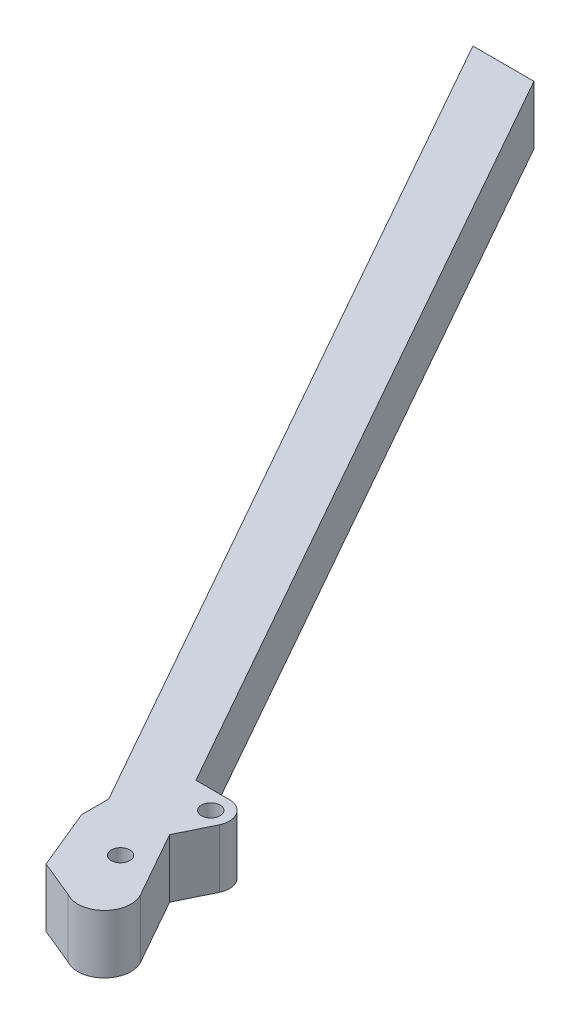
ISO-10303-21;
HEADER;
FILE_DESCRIPTION(('STEP AP214'),'2;1');
FILE_NAME('part.step','',(''),(''),'','','');
FILE_SCHEMA(('AUTOMOTIVE_DESIGN { 1 0 10303 214 1 1 1 1 }'));
ENDSEC;
DATA;
#1=APPLICATION_CONTEXT('core data for automotive mechanical design processes');
#2=APPLICATION_PROTOCOL_DEFINITION('international standard','automotive_design',2000,#1);
#3=PRODUCT_CONTEXT('',#1,'mechanical');
#4=PRODUCT('Part','Part','',(#3));
#5=PRODUCT_RELATED_PRODUCT_CATEGORY('part','',(#4));
#6=PRODUCT_DEFINITION_FORMATION('','',#4);
#7=PRODUCT_DEFINITION_CONTEXT('part definition',#1,'design');
#8=PRODUCT_DEFINITION('design','',#6,#7);
#9=PRODUCT_DEFINITION_SHAPE('','',#8);
#10=(LENGTH_UNIT() NAMED_UNIT(*) SI_UNIT(.MILLI.,.METRE.));
#11=(NAMED_UNIT(*) PLANE_ANGLE_UNIT() SI_UNIT($,.RADIAN.));
#12=(NAMED_UNIT(*) SI_UNIT($,.STERADIAN.) SOLID_ANGLE_UNIT());
#13=UNCERTAINTY_MEASURE_WITH_UNIT(LENGTH_MEASURE(1.E-05),#10,'distance_accuracy_value','');
#14=(GEOMETRIC_REPRESENTATION_CONTEXT(3) GLOBAL_UNCERTAINTY_ASSIGNED_CONTEXT((#13)) GLOBAL_UNIT_ASSIGNED_CONTEXT((#10,
#11,#12)) REPRESENTATION_CONTEXT('',''));
#15=CARTESIAN_POINT('',(0.,0.,0.));
#16=DIRECTION('',(0.,0.,1.));
#17=DIRECTION('',(1.,0.,0.));
#18=AXIS2_PLACEMENT_3D('',#15,#16,#17);
#19=CARTESIAN_POINT('',(-2.64003065902823,5.5,0.741151356722327));
#20=DIRECTION('',(0.,-1.,0.));
#21=DIRECTION('',(0.,0.,-1.));
#22=AXIS2_PLACEMENT_3D('',#19,#20,#21);
#23=CYLINDRICAL_SURFACE('',#22,4.99999999999998);
#24=DIRECTION('',(0.,1.,0.));
#25=VECTOR('',#24,1.);
#26=CARTESIAN_POINT('',(-5.15081564539759,-5.5,5.06503372702589));
#27=LINE('',#26,#25);
#28=CARTESIAN_POINT('',(-5.15081564539759,-5.5,5.06503372702589));
#29=VERTEX_POINT('',#28);
#30=CARTESIAN_POINT('',(-5.15081564539759,5.5,5.06503372702589));
#31=VERTEX_POINT('',#30);
#32=EDGE_CURVE('E198',#29,#31,#27,.T.);
#33=ORIENTED_EDGE('',*,*,#32,.F.);
#34=CARTESIAN_POINT('',(-2.64003065902823,-5.5,0.741151356722327));
#35=DIRECTION('',(0.,1.,0.));
#36=DIRECTION('',(0.,0.,-1.));
#37=AXIS2_PLACEMENT_3D('',#34,#35,#36);
#38=CIRCLE('',#37,4.99999999999998);
#39=CARTESIAN_POINT('',(1.71604658167932,-5.5,-1.71335288507263));
#40=VERTEX_POINT('',#39);
#41=EDGE_CURVE('E137',#29,#40,#38,.T.);
#42=ORIENTED_EDGE('',*,*,#41,.T.);
#43=DIRECTION('',(0.,-1.,0.));
#44=VECTOR('',#43,1.);
#45=CARTESIAN_POINT('',(1.71604658167932,5.5,-1.71335288507263));
#46=LINE('',#45,#44);
#47=CARTESIAN_POINT('',(1.71604658167932,5.5,-1.71335288507263));
#48=VERTEX_POINT('',#47);
#49=EDGE_CURVE('E11',#48,#40,#46,.T.);
#50=ORIENTED_EDGE('',*,*,#49,.F.);
#51=CARTESIAN_POINT('',(-2.64003065902823,5.5,0.741151356722327));
#52=DIRECTION('',(0.,1.,0.));
#53=DIRECTION('',(0.,0.,-1.));
#54=AXIS2_PLACEMENT_3D('',#51,#52,#53);
#55=CIRCLE('',#54,4.99999999999998);
#56=EDGE_CURVE('E96',#31,#48,#55,.T.);
#57=ORIENTED_EDGE('',*,*,#56,.F.);
#58=EDGE_LOOP('',(#33,#42,#50,#57));
#59=FACE_BOUND('',#58,.T.);
#60=ADVANCED_FACE('F39',(#59),#23,.T.);
#61=CARTESIAN_POINT('',(-6.99610789973579,5.5,3.19565559851728));
#62=DIRECTION('',(0.871215448141515,0.,-0.490900848358993));
#63=DIRECTION('',(-0.490900848358993,0.,-0.871215448141515));
#64=AXIS2_PLACEMENT_3D('',#61,#62,#63);
#65=PLANE('',#64);
#66=DIRECTION('',(0.,1.,0.));
#67=VECTOR('',#66,1.);
#68=CARTESIAN_POINT('',(-16.8311388995431,-5.5,-14.2588486432777));
#69=LINE('',#68,#67);
#70=CARTESIAN_POINT('',(-16.8311388995431,-5.5,-14.2588486432777));
#71=VERTEX_POINT('',#70);
#72=CARTESIAN_POINT('',(-16.8311388995431,5.5,-14.2588486432777));
#73=VERTEX_POINT('',#72);
#74=EDGE_CURVE('E188',#71,#73,#69,.T.);
#75=ORIENTED_EDGE('',*,*,#74,.T.);
#76=DIRECTION('',(0.490900848358993,0.,0.871215448141515));
#77=VECTOR('',#76,1.);
#78=CARTESIAN_POINT('',(-6.99610789973579,5.5,3.19565559851728));
#79=LINE('',#78,#77);
#80=CARTESIAN_POINT('',(-105.176277571534,5.5,-171.047434029786));
#81=VERTEX_POINT('',#80);
#82=EDGE_CURVE('E131',#81,#73,#79,.T.);
#83=ORIENTED_EDGE('',*,*,#82,.F.);
#84=DIRECTION('',(0.,-1.,0.));
#85=VECTOR('',#84,1.);
#86=CARTESIAN_POINT('',(-105.176277571534,5.5,-171.047434029786));
#87=LINE('',#86,#85);
#88=CARTESIAN_POINT('',(-105.176277571534,-5.5,-171.047434029786));
#89=VERTEX_POINT('',#88);
#90=EDGE_CURVE('E136',#81,#89,#87,.T.);
#91=ORIENTED_EDGE('',*,*,#90,.T.);
#92=DIRECTION('',(0.490900848358993,0.,0.871215448141515));
#93=VECTOR('',#92,1.);
#94=CARTESIAN_POINT('',(-6.99610789973579,-5.5,3.19565559851728));
#95=LINE('',#94,#93);
#96=EDGE_CURVE('E149',#89,#71,#95,.T.);
#97=ORIENTED_EDGE('',*,*,#96,.T.);
#98=EDGE_LOOP('',(#75,#83,#91,#97));
#99=FACE_BOUND('',#98,.T.);
#100=ADVANCED_FACE('F232',(#99),#65,.F.);
#101=CARTESIAN_POINT('',(-2.64003065902823,5.5,0.741151356722327));
#102=DIRECTION('',(0.,-1.,0.));
#103=DIRECTION('',(0.,0.,-1.));
#104=AXIS2_PLACEMENT_3D('',#101,#102,#103);
#105=PLANE('',#104);
#106=DIRECTION('',(-0.925284518560713,0.,-0.379273726630082));
#107=VECTOR('',#106,1.);
#108=CARTESIAN_POINT('',(-2.51844063269181,5.5,6.1440431137925));
#109=LINE('',#108,#107);
#110=CARTESIAN_POINT('',(-12.1508156453976,5.5,2.19573673442051));
#111=VERTEX_POINT('',#110);
#112=EDGE_CURVE('E203',#31,#111,#109,.T.);
#113=ORIENTED_EDGE('',*,*,#112,.F.);
#114=ORIENTED_EDGE('',*,*,#56,.T.);
#115=DIRECTION('',(-0.490900848358991,0.,-0.871215448141516));
#116=VECTOR('',#115,1.);
#117=CARTESIAN_POINT('',(-5.31094638153674,5.5,-14.1843535851134));
#118=LINE('',#117,#116);
#119=CARTESIAN_POINT('',(-5.31094638153674,5.5,-14.1843535851134));
#120=VERTEX_POINT('',#119);
#121=EDGE_CURVE('E174',#48,#120,#118,.T.);
#122=ORIENTED_EDGE('',*,*,#121,.T.);
#123=DIRECTION('',(0.437735708535673,0.,-0.899103692280691));
#124=VECTOR('',#123,1.);
#125=CARTESIAN_POINT('',(-2.24679642178702,5.5,-20.4780794310782));
#126=LINE('',#125,#124);
#127=CARTESIAN_POINT('',(-2.24679642178702,5.5,-20.4780794310782));
#128=VERTEX_POINT('',#127);
#129=EDGE_CURVE('E164',#120,#128,#126,.T.);
#130=ORIENTED_EDGE('',*,*,#129,.T.);
#131=CARTESIAN_POINT('',(-5.39365934476944,5.5,-22.0101544109531));
#132=DIRECTION('',(0.,1.,0.));
#133=DIRECTION('',(0.,0.,-1.));
#134=AXIS2_PLACEMENT_3D('',#131,#132,#133);
#135=CIRCLE('',#134,3.5);
#136=CARTESIAN_POINT('',(-5.39365934476944,5.5,-25.5101544109531));
#137=VERTEX_POINT('',#136);
#138=EDGE_CURVE('E117',#128,#137,#135,.T.);
#139=ORIENTED_EDGE('',*,*,#138,.T.);
#140=DIRECTION('',(-1.,0.,0.));
#141=VECTOR('',#140,1.);
#142=CARTESIAN_POINT('',(-11.6926574102036,5.5,-25.5101544109531));
#143=LINE('',#142,#141);
#144=CARTESIAN_POINT('',(-11.6926574102036,5.5,-25.5101544109531));
#145=VERTEX_POINT('',#144);
#146=EDGE_CURVE('E110',#137,#145,#143,.T.);
#147=ORIENTED_EDGE('',*,*,#146,.T.);
#148=DIRECTION('',(-0.490900848358993,0.,-0.871215448141515));
#149=VECTOR('',#148,1.);
#150=CARTESIAN_POINT('',(-93.6980605342538,5.5,-171.047434029786));
#151=LINE('',#150,#149);
#152=CARTESIAN_POINT('',(-93.6980605342538,5.5,-171.047434029786));
#153=VERTEX_POINT('',#152);
#154=EDGE_CURVE('E115',#145,#153,#151,.T.);
#155=ORIENTED_EDGE('',*,*,#154,.T.);
#156=DIRECTION('',(-1.,0.,0.));
#157=VECTOR('',#156,1.);
#158=CARTESIAN_POINT('',(-105.176277571534,5.5,-171.047434029786));
#159=LINE('',#158,#157);
#160=EDGE_CURVE('E55',#153,#81,#159,.T.);
#161=ORIENTED_EDGE('',*,*,#160,.T.);
#162=ORIENTED_EDGE('',*,*,#82,.T.);
#163=DIRECTION('',(0.00132236606233538,0.,-0.999999125673616));
#164=VECTOR('',#163,1.);
#165=CARTESIAN_POINT('',(-16.8499648687864,5.5,-0.0222818411756281));
#166=LINE('',#165,#164);
#167=CARTESIAN_POINT('',(-16.8378575225708,5.5,-9.17809427064706));
#168=VERTEX_POINT('',#167);
#169=EDGE_CURVE('E210',#168,#73,#166,.T.);
#170=ORIENTED_EDGE('',*,*,#169,.F.);
#171=DIRECTION('',(-0.381006937577269,0.,-0.924572178641555));
#172=VECTOR('',#171,1.);
#173=CARTESIAN_POINT('',(-11.1604155581995,5.5,4.5990955083322));
#174=LINE('',#173,#172);
#175=EDGE_CURVE('E207',#111,#168,#174,.T.);
#176=ORIENTED_EDGE('',*,*,#175,.F.);
#177=EDGE_LOOP('',(#113,#114,#122,#130,#139,#147,#155,#161,#162,#170,#176));
#178=FACE_BOUND('',#177,.T.);
#179=CARTESIAN_POINT('',(-5.39365934476944,5.5,-22.0101544109531));
#180=DIRECTION('',(0.,1.,0.));
#181=DIRECTION('',(0.,0.,1.));
#182=AXIS2_PLACEMENT_3D('',#179,#180,#181);
#183=CIRCLE('',#182,1.75);
#184=CARTESIAN_POINT('',(-5.39365934476944,5.5,-20.2601544109531));
#185=VERTEX_POINT('',#184);
#186=EDGE_CURVE('E140',#185,#185,#183,.T.);
#187=ORIENTED_EDGE('',*,*,#186,.F.);
#188=EDGE_LOOP('',(#187));
#189=FACE_BOUND('',#188,.T.);
#190=CARTESIAN_POINT('',(-6.56723744590018,5.5,-6.22857222840979));
#191=DIRECTION('',(0.,1.,0.));
#192=DIRECTION('',(0.,0.,1.));
#193=AXIS2_PLACEMENT_3D('',#190,#191,#192);
#194=CIRCLE('',#193,1.75000000000002);
#195=CARTESIAN_POINT('',(-6.56723744590018,5.5,-4.47857222840977));
#196=VERTEX_POINT('',#195);
#197=EDGE_CURVE('E182',#196,#196,#194,.T.);
#198=ORIENTED_EDGE('',*,*,#197,.F.);
#199=EDGE_LOOP('',(#198));
#200=FACE_BOUND('',#199,.T.);
#201=ADVANCED_FACE('F112',(#178,#189,#200),#105,.F.);
#202=CARTESIAN_POINT('',(-2.64003065902823,-5.5,0.741151356722327));
#203=DIRECTION('',(0.,-1.,0.));
#204=DIRECTION('',(0.,0.,-1.));
#205=AXIS2_PLACEMENT_3D('',#202,#203,#204);
#206=PLANE('',#205);
#207=ORIENTED_EDGE('',*,*,#41,.F.);
#208=DIRECTION('',(-0.925284518560713,0.,-0.379273726630082));
#209=VECTOR('',#208,1.);
#210=CARTESIAN_POINT('',(-2.51844063269181,-5.5,6.1440431137925));
#211=LINE('',#210,#209);
#212=CARTESIAN_POINT('',(-12.1508156453976,-5.5,2.19573673442051));
#213=VERTEX_POINT('',#212);
#214=EDGE_CURVE('E195',#29,#213,#211,.T.);
#215=ORIENTED_EDGE('',*,*,#214,.T.);
#216=DIRECTION('',(-0.381006937577269,0.,-0.924572178641555));
#217=VECTOR('',#216,1.);
#218=CARTESIAN_POINT('',(-11.1604155581995,-5.5,4.5990955083322));
#219=LINE('',#218,#217);
#220=CARTESIAN_POINT('',(-16.8378575225708,-5.5,-9.17809427064706));
#221=VERTEX_POINT('',#220);
#222=EDGE_CURVE('E215',#213,#221,#219,.T.);
#223=ORIENTED_EDGE('',*,*,#222,.T.);
#224=DIRECTION('',(0.00132236606233538,0.,-0.999999125673616));
#225=VECTOR('',#224,1.);
#226=CARTESIAN_POINT('',(-16.8499648687864,-5.5,-0.0222818411756281));
#227=LINE('',#226,#225);
#228=EDGE_CURVE('E206',#221,#71,#227,.T.);
#229=ORIENTED_EDGE('',*,*,#228,.T.);
#230=ORIENTED_EDGE('',*,*,#96,.F.);
#231=DIRECTION('',(-1.,0.,0.));
#232=VECTOR('',#231,1.);
#233=CARTESIAN_POINT('',(-105.176277571534,-5.5,-171.047434029786));
#234=LINE('',#233,#232);
#235=CARTESIAN_POINT('',(-93.6980605342538,-5.5,-171.047434029786));
#236=VERTEX_POINT('',#235);
#237=EDGE_CURVE('E88',#236,#89,#234,.T.);
#238=ORIENTED_EDGE('',*,*,#237,.F.);
#239=DIRECTION('',(-0.490900848358993,0.,-0.871215448141515));
#240=VECTOR('',#239,1.);
#241=CARTESIAN_POINT('',(-93.6980605342538,-5.5,-171.047434029786));
#242=LINE('',#241,#240);
#243=CARTESIAN_POINT('',(-11.6926574102036,-5.5,-25.5101544109531));
#244=VERTEX_POINT('',#243);
#245=EDGE_CURVE('E82',#244,#236,#242,.T.);
#246=ORIENTED_EDGE('',*,*,#245,.F.);
#247=DIRECTION('',(-1.,0.,0.));
#248=VECTOR('',#247,1.);
#249=CARTESIAN_POINT('',(-11.6926574102036,-5.5,-25.5101544109531));
#250=LINE('',#249,#248);
#251=CARTESIAN_POINT('',(-5.39365934476944,-5.5,-25.5101544109531));
#252=VERTEX_POINT('',#251);
#253=EDGE_CURVE('E125',#252,#244,#250,.T.);
#254=ORIENTED_EDGE('',*,*,#253,.F.);
#255=CARTESIAN_POINT('',(-5.39365934476944,-5.5,-22.0101544109531));
#256=DIRECTION('',(0.,1.,0.));
#257=DIRECTION('',(0.,0.,-1.));
#258=AXIS2_PLACEMENT_3D('',#255,#256,#257);
#259=CIRCLE('',#258,3.5);
#260=CARTESIAN_POINT('',(-2.24679642178702,-5.5,-20.4780794310782));
#261=VERTEX_POINT('',#260);
#262=EDGE_CURVE('E144',#261,#252,#259,.T.);
#263=ORIENTED_EDGE('',*,*,#262,.F.);
#264=DIRECTION('',(0.437735708535673,0.,-0.899103692280691));
#265=VECTOR('',#264,1.);
#266=CARTESIAN_POINT('',(-2.24679642178702,-5.5,-20.4780794310782));
#267=LINE('',#266,#265);
#268=CARTESIAN_POINT('',(-5.31094638153674,-5.5,-14.1843535851134));
#269=VERTEX_POINT('',#268);
#270=EDGE_CURVE('E142',#269,#261,#267,.T.);
#271=ORIENTED_EDGE('',*,*,#270,.F.);
#272=DIRECTION('',(-0.490900848358991,0.,-0.871215448141516));
#273=VECTOR('',#272,1.);
#274=CARTESIAN_POINT('',(-5.31094638153674,-5.5,-14.1843535851134));
#275=LINE('',#274,#273);
#276=EDGE_CURVE('E139',#40,#269,#275,.T.);
#277=ORIENTED_EDGE('',*,*,#276,.F.);
#278=EDGE_LOOP('',(#207,#215,#223,#229,#230,#238,#246,#254,#263,#271,#277));
#279=FACE_BOUND('',#278,.T.);
#280=CARTESIAN_POINT('',(-5.39365934476944,-5.5,-22.0101544109531));
#281=DIRECTION('',(0.,1.,0.));
#282=DIRECTION('',(0.,0.,1.));
#283=AXIS2_PLACEMENT_3D('',#280,#281,#282);
#284=CIRCLE('',#283,1.75);
#285=CARTESIAN_POINT('',(-5.39365934476944,-5.5,-20.2601544109531));
#286=VERTEX_POINT('',#285);
#287=EDGE_CURVE('E179',#286,#286,#284,.T.);
#288=ORIENTED_EDGE('',*,*,#287,.T.);
#289=EDGE_LOOP('',(#288));
#290=FACE_BOUND('',#289,.T.);
#291=CARTESIAN_POINT('',(-6.56723744590018,-5.5,-6.22857222840979));
#292=DIRECTION('',(0.,1.,0.));
#293=DIRECTION('',(0.,0.,1.));
#294=AXIS2_PLACEMENT_3D('',#291,#292,#293);
#295=CIRCLE('',#294,1.75000000000002);
#296=CARTESIAN_POINT('',(-6.56723744590018,-5.5,-4.47857222840977));
#297=VERTEX_POINT('',#296);
#298=EDGE_CURVE('E185',#297,#297,#295,.T.);
#299=ORIENTED_EDGE('',*,*,#298,.T.);
#300=EDGE_LOOP('',(#299));
#301=FACE_BOUND('',#300,.T.);
#302=ADVANCED_FACE('F170',(#279,#290,#301),#206,.T.);
#303=CARTESIAN_POINT('',(-5.31094638153674,5.5,-14.1843535851134));
#304=DIRECTION('',(-0.871215448141516,0.,0.490900848358991));
#305=DIRECTION('',(0.490900848358991,0.,0.871215448141516));
#306=AXIS2_PLACEMENT_3D('',#303,#304,#305);
#307=PLANE('',#306);
#308=ORIENTED_EDGE('',*,*,#276,.T.);
#309=DIRECTION('',(0.,-1.,0.));
#310=VECTOR('',#309,1.);
#311=CARTESIAN_POINT('',(-5.31094638153674,5.5,-14.1843535851134));
#312=LINE('',#311,#310);
#313=EDGE_CURVE('E47',#120,#269,#312,.T.);
#314=ORIENTED_EDGE('',*,*,#313,.F.);
#315=ORIENTED_EDGE('',*,*,#121,.F.);
#316=ORIENTED_EDGE('',*,*,#49,.T.);
#317=EDGE_LOOP('',(#308,#314,#315,#316));
#318=FACE_BOUND('',#317,.T.);
#319=ADVANCED_FACE('F284',(#318),#307,.F.);
#320=CARTESIAN_POINT('',(-2.24679642178702,5.5,-20.4780794310782));
#321=DIRECTION('',(-0.899103692280691,0.,-0.437735708535673));
#322=DIRECTION('',(-0.437735708535673,0.,0.899103692280691));
#323=AXIS2_PLACEMENT_3D('',#320,#321,#322);
#324=PLANE('',#323);
#325=ORIENTED_EDGE('',*,*,#270,.T.);
#326=DIRECTION('',(0.,-1.,0.));
#327=VECTOR('',#326,1.);
#328=CARTESIAN_POINT('',(-2.24679642178702,5.5,-20.4780794310782));
#329=LINE('',#328,#327);
#330=EDGE_CURVE('E155',#128,#261,#329,.T.);
#331=ORIENTED_EDGE('',*,*,#330,.F.);
#332=ORIENTED_EDGE('',*,*,#129,.F.);
#333=ORIENTED_EDGE('',*,*,#313,.T.);
#334=EDGE_LOOP('',(#325,#331,#332,#333));
#335=FACE_BOUND('',#334,.T.);
#336=ADVANCED_FACE('F162',(#335),#324,.F.);
#337=CARTESIAN_POINT('',(-5.39365934476944,5.5,-22.0101544109531));
#338=DIRECTION('',(0.,-1.,0.));
#339=DIRECTION('',(0.,0.,-1.));
#340=AXIS2_PLACEMENT_3D('',#337,#338,#339);
#341=CYLINDRICAL_SURFACE('',#340,3.5);
#342=ORIENTED_EDGE('',*,*,#262,.T.);
#343=DIRECTION('',(0.,-1.,0.));
#344=VECTOR('',#343,1.);
#345=CARTESIAN_POINT('',(-5.39365934476944,5.5,-25.5101544109531));
#346=LINE('',#345,#344);
#347=EDGE_CURVE('E126',#137,#252,#346,.T.);
#348=ORIENTED_EDGE('',*,*,#347,.F.);
#349=ORIENTED_EDGE('',*,*,#138,.F.);
#350=ORIENTED_EDGE('',*,*,#330,.T.);
#351=EDGE_LOOP('',(#342,#348,#349,#350));
#352=FACE_BOUND('',#351,.T.);
#353=ADVANCED_FACE('F173',(#352),#341,.T.);
#354=CARTESIAN_POINT('',(-11.6926574102036,5.5,-25.5101544109531));
#355=DIRECTION('',(0.,0.,1.));
#356=DIRECTION('',(1.,0.,0.));
#357=AXIS2_PLACEMENT_3D('',#354,#355,#356);
#358=PLANE('',#357);
#359=ORIENTED_EDGE('',*,*,#253,.T.);
#360=DIRECTION('',(0.,-1.,0.));
#361=VECTOR('',#360,1.);
#362=CARTESIAN_POINT('',(-11.6926574102036,5.5,-25.5101544109531));
#363=LINE('',#362,#361);
#364=EDGE_CURVE('E122',#145,#244,#363,.T.);
#365=ORIENTED_EDGE('',*,*,#364,.F.);
#366=ORIENTED_EDGE('',*,*,#146,.F.);
#367=ORIENTED_EDGE('',*,*,#347,.T.);
#368=EDGE_LOOP('',(#359,#365,#366,#367));
#369=FACE_BOUND('',#368,.T.);
#370=ADVANCED_FACE('F123',(#369),#358,.F.);
#371=CARTESIAN_POINT('',(-93.6980605342538,5.5,-171.047434029786));
#372=DIRECTION('',(-0.871215448141515,0.,0.490900848358993));
#373=DIRECTION('',(0.490900848358993,0.,0.871215448141515));
#374=AXIS2_PLACEMENT_3D('',#371,#372,#373);
#375=PLANE('',#374);
#376=ORIENTED_EDGE('',*,*,#245,.T.);
#377=DIRECTION('',(0.,-1.,0.));
#378=VECTOR('',#377,1.);
#379=CARTESIAN_POINT('',(-93.6980605342538,5.5,-171.047434029786));
#380=LINE('',#379,#378);
#381=EDGE_CURVE('E127',#153,#236,#380,.T.);
#382=ORIENTED_EDGE('',*,*,#381,.F.);
#383=ORIENTED_EDGE('',*,*,#154,.F.);
#384=ORIENTED_EDGE('',*,*,#364,.T.);
#385=EDGE_LOOP('',(#376,#382,#383,#384));
#386=FACE_BOUND('',#385,.T.);
#387=ADVANCED_FACE('F129',(#386),#375,.F.);
#388=CARTESIAN_POINT('',(-105.176277571534,5.5,-171.047434029786));
#389=DIRECTION('',(0.,0.,1.));
#390=DIRECTION('',(1.,0.,0.));
#391=AXIS2_PLACEMENT_3D('',#388,#389,#390);
#392=PLANE('',#391);
#393=ORIENTED_EDGE('',*,*,#237,.T.);
#394=ORIENTED_EDGE('',*,*,#90,.F.);
#395=ORIENTED_EDGE('',*,*,#160,.F.);
#396=ORIENTED_EDGE('',*,*,#381,.T.);
#397=EDGE_LOOP('',(#393,#394,#395,#396));
#398=FACE_BOUND('',#397,.T.);
#399=ADVANCED_FACE('F233',(#398),#392,.F.);
#400=CARTESIAN_POINT('',(-5.39365934476944,5.5,-22.0101544109531));
#401=DIRECTION('',(0.,-1.,0.));
#402=DIRECTION('',(0.,0.,-1.));
#403=AXIS2_PLACEMENT_3D('',#400,#401,#402);
#404=CYLINDRICAL_SURFACE('',#403,1.75);
#405=ORIENTED_EDGE('',*,*,#186,.T.);
#406=EDGE_LOOP('',(#405));
#407=FACE_BOUND('',#406,.T.);
#408=ORIENTED_EDGE('',*,*,#287,.F.);
#409=EDGE_LOOP('',(#408));
#410=FACE_BOUND('',#409,.T.);
#411=ADVANCED_FACE('F235',(#407,#410),#404,.F.);
#412=CARTESIAN_POINT('',(-6.56723744590018,5.5,-6.22857222840979));
#413=DIRECTION('',(0.,-1.,0.));
#414=DIRECTION('',(0.,0.,-1.));
#415=AXIS2_PLACEMENT_3D('',#412,#413,#414);
#416=CYLINDRICAL_SURFACE('',#415,1.75000000000002);
#417=ORIENTED_EDGE('',*,*,#197,.T.);
#418=EDGE_LOOP('',(#417));
#419=FACE_BOUND('',#418,.T.);
#420=ORIENTED_EDGE('',*,*,#298,.F.);
#421=EDGE_LOOP('',(#420));
#422=FACE_BOUND('',#421,.T.);
#423=ADVANCED_FACE('F241',(#419,#422),#416,.F.);
#424=CARTESIAN_POINT('',(-16.8499648687864,-5.5,-0.0222818411756281));
#425=DIRECTION('',(0.999999125673616,0.,0.00132236606233538));
#426=DIRECTION('',(0.00132236606233538,0.,-0.999999125673616));
#427=AXIS2_PLACEMENT_3D('',#424,#425,#426);
#428=PLANE('',#427);
#429=ORIENTED_EDGE('',*,*,#169,.T.);
#430=ORIENTED_EDGE('',*,*,#74,.F.);
#431=ORIENTED_EDGE('',*,*,#228,.F.);
#432=DIRECTION('',(0.,1.,0.));
#433=VECTOR('',#432,1.);
#434=CARTESIAN_POINT('',(-16.8378575225708,-5.5,-9.17809427064706));
#435=LINE('',#434,#433);
#436=EDGE_CURVE('E191',#221,#168,#435,.T.);
#437=ORIENTED_EDGE('',*,*,#436,.T.);
#438=EDGE_LOOP('',(#429,#430,#431,#437));
#439=FACE_BOUND('',#438,.T.);
#440=ADVANCED_FACE('F228',(#439),#428,.F.);
#441=CARTESIAN_POINT('',(-2.51844063269181,-5.5,6.1440431137925));
#442=DIRECTION('',(0.379273726630082,0.,-0.925284518560713));
#443=DIRECTION('',(-0.925284518560713,0.,-0.379273726630082));
#444=AXIS2_PLACEMENT_3D('',#441,#442,#443);
#445=PLANE('',#444);
#446=ORIENTED_EDGE('',*,*,#112,.T.);
#447=DIRECTION('',(0.,1.,0.));
#448=VECTOR('',#447,1.);
#449=CARTESIAN_POINT('',(-12.1508156453976,-5.5,2.19573673442051));
#450=LINE('',#449,#448);
#451=EDGE_CURVE('E194',#213,#111,#450,.T.);
#452=ORIENTED_EDGE('',*,*,#451,.F.);
#453=ORIENTED_EDGE('',*,*,#214,.F.);
#454=ORIENTED_EDGE('',*,*,#32,.T.);
#455=EDGE_LOOP('',(#446,#452,#453,#454));
#456=FACE_BOUND('',#455,.T.);
#457=ADVANCED_FACE('F260',(#456),#445,.F.);
#458=CARTESIAN_POINT('',(-11.1604155581995,-5.5,4.5990955083322));
#459=DIRECTION('',(0.924572178641555,0.,-0.381006937577269));
#460=DIRECTION('',(-0.381006937577269,0.,-0.924572178641555));
#461=AXIS2_PLACEMENT_3D('',#458,#459,#460);
#462=PLANE('',#461);
#463=ORIENTED_EDGE('',*,*,#175,.T.);
#464=ORIENTED_EDGE('',*,*,#436,.F.);
#465=ORIENTED_EDGE('',*,*,#222,.F.);
#466=ORIENTED_EDGE('',*,*,#451,.T.);
#467=EDGE_LOOP('',(#463,#464,#465,#466));
#468=FACE_BOUND('',#467,.T.);
#469=ADVANCED_FACE('F264',(#468),#462,.F.);
#470=CLOSED_SHELL('',(#60,#100,#201,#302,#319,#336,#353,#370,#387,#399,#411,#423,#440,#457,#469));
#471=MANIFOLD_SOLID_BREP('B2',#470);
#472=ADVANCED_BREP_SHAPE_REPRESENTATION('',(#18,#471),#14);
#473=SHAPE_DEFINITION_REPRESENTATION(#9,#472);
ENDSEC;
END-ISO-10303-21;
